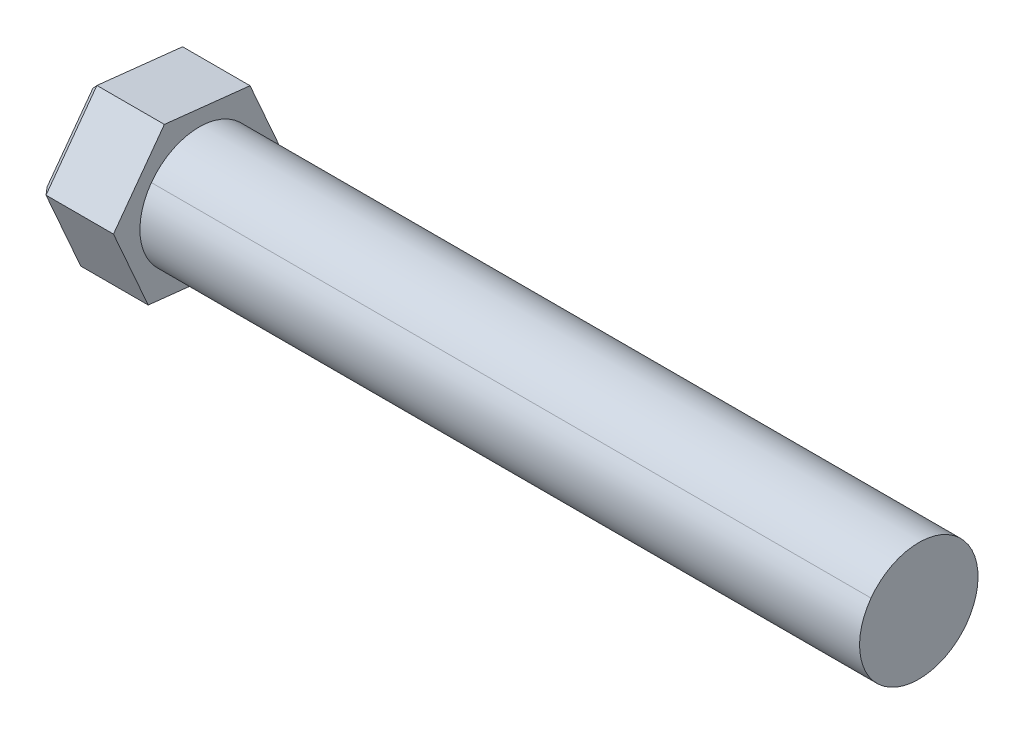
ISO-10303-21;
HEADER;
FILE_DESCRIPTION(('STEP AP214'),'2;1');
FILE_NAME('part.step','',(''),(''),'','','');
FILE_SCHEMA(('AUTOMOTIVE_DESIGN { 1 0 10303 214 1 1 1 1 }'));
ENDSEC;
DATA;
#1=APPLICATION_CONTEXT('core data for automotive mechanical design processes');
#2=APPLICATION_PROTOCOL_DEFINITION('international standard','automotive_design',2000,#1);
#3=PRODUCT_CONTEXT('',#1,'mechanical');
#4=PRODUCT('Part','Part','',(#3));
#5=PRODUCT_RELATED_PRODUCT_CATEGORY('part','',(#4));
#6=PRODUCT_DEFINITION_FORMATION('','',#4);
#7=PRODUCT_DEFINITION_CONTEXT('part definition',#1,'design');
#8=PRODUCT_DEFINITION('design','',#6,#7);
#9=PRODUCT_DEFINITION_SHAPE('','',#8);
#10=(LENGTH_UNIT() NAMED_UNIT(*) SI_UNIT(.MILLI.,.METRE.));
#11=(NAMED_UNIT(*) PLANE_ANGLE_UNIT() SI_UNIT($,.RADIAN.));
#12=(NAMED_UNIT(*) SI_UNIT($,.STERADIAN.) SOLID_ANGLE_UNIT());
#13=UNCERTAINTY_MEASURE_WITH_UNIT(LENGTH_MEASURE(1.E-05),#10,'distance_accuracy_value','');
#14=(GEOMETRIC_REPRESENTATION_CONTEXT(3) GLOBAL_UNCERTAINTY_ASSIGNED_CONTEXT((#13)) GLOBAL_UNIT_ASSIGNED_CONTEXT((#10,
#11,#12)) REPRESENTATION_CONTEXT('',''));
#15=CARTESIAN_POINT('',(0.,0.,0.));
#16=DIRECTION('',(0.,0.,1.));
#17=DIRECTION('',(1.,0.,0.));
#18=AXIS2_PLACEMENT_3D('',#15,#16,#17);
#19=CARTESIAN_POINT('',(-26.156988266467,-0.505944143547208,35.0040039047274));
#20=DIRECTION('',(0.707106781186545,-0.28525456636669,0.647016099001374));
#21=DIRECTION('',(0.,-0.915018942281472,-0.403410876484628));
#22=AXIS2_PLACEMENT_3D('',#19,#20,#21);
#23=PLANE('',#22);
#24=DIRECTION('',(0.65465367070798,0.60993906340706,-0.446545529995191));
#25=VECTOR('',#24,1.);
#26=CARTESIAN_POINT('',(-26.7966473512185,1.26354972035595,36.4831996817549));
#27=LINE('',#26,#25);
#28=CARTESIAN_POINT('',(-26.156988266467,1.85951836837592,36.046882102251));
#29=VERTEX_POINT('',#28);
#30=CARTESIAN_POINT('',(-25.656988266467,2.32536702293815,35.7058273201765));
#31=VERTEX_POINT('',#30);
#32=EDGE_CURVE('E25',#29,#31,#27,.T.);
#33=ORIENTED_EDGE('',*,*,#32,.T.);
#34=DIRECTION('',(0.,0.915018942281472,0.403410876484628));
#35=VECTOR('',#34,1.);
#36=CARTESIAN_POINT('',(-25.656988266467,2.32536702293815,35.7058273201765));
#37=LINE('',#36,#35);
#38=CARTESIAN_POINT('',(-25.656988266467,-2.93384443354793,33.3871615469969));
#39=VERTEX_POINT('',#38);
#40=EDGE_CURVE('E219',#39,#31,#37,.T.);
#41=ORIENTED_EDGE('',*,*,#40,.F.);
#42=DIRECTION('',(-0.65465367070798,0.0817502412186923,0.751495488668597));
#43=VECTOR('',#42,1.);
#44=CARTESIAN_POINT('',(-26.7966473512185,-2.79152887151228,34.6954084860002));
#45=LINE('',#44,#43);
#46=CARTESIAN_POINT('',(-26.156988266467,-2.87140665547034,33.9611257072038));
#47=VERTEX_POINT('',#46);
#48=EDGE_CURVE('E11',#39,#47,#45,.T.);
#49=ORIENTED_EDGE('',*,*,#48,.T.);
#50=DIRECTION('',(0.,-0.915018942281472,-0.403410876484628));
#51=VECTOR('',#50,1.);
#52=CARTESIAN_POINT('',(-26.156988266467,-0.505944143547208,35.0040039047274));
#53=LINE('',#52,#51);
#54=EDGE_CURVE('E230',#29,#47,#53,.T.);
#55=ORIENTED_EDGE('',*,*,#54,.F.);
#56=EDGE_LOOP('',(#33,#41,#49,#55));
#57=FACE_BOUND('',#56,.T.);
#58=ADVANCED_FACE('F17',(#57),#23,.F.);
#59=CARTESIAN_POINT('',(-26.156988266467,-4.95729692354026,35.4882372354672));
#60=DIRECTION('',(0.707106781186545,0.417705095209352,0.570545750519755));
#61=DIRECTION('',(0.,-0.806873538339371,0.590724210717408));
#62=AXIS2_PLACEMENT_3D('',#59,#60,#61);
#63=PLANE('',#62);
#64=DIRECTION('',(-0.65465367070798,0.691689304625752,0.304949958673404));
#65=VECTOR('',#64,1.);
#66=CARTESIAN_POINT('',(-26.7966473512185,-6.36734075963214,37.3133139630231));
#67=LINE('',#66,#65);
#68=CARTESIAN_POINT('',(-25.656988266467,-7.57147362424998,36.7824393855982));
#69=VERTEX_POINT('',#68);
#70=CARTESIAN_POINT('',(-26.156988266467,-7.04318719161017,37.0153487637306));
#71=VERTEX_POINT('',#70);
#72=EDGE_CURVE('E257',#69,#71,#67,.T.);
#73=ORIENTED_EDGE('',*,*,#72,.T.);
#74=DIRECTION('',(0.,-0.806873538339371,0.590724210717407));
#75=VECTOR('',#74,1.);
#76=CARTESIAN_POINT('',(-26.156988266467,-4.95729692354026,35.4882372354672));
#77=LINE('',#76,#75);
#78=EDGE_CURVE('E234',#47,#71,#77,.T.);
#79=ORIENTED_EDGE('',*,*,#78,.F.);
#80=ORIENTED_EDGE('',*,*,#48,.F.);
#81=DIRECTION('',(0.,0.806873538339371,-0.590724210717407));
#82=VECTOR('',#81,1.);
#83=CARTESIAN_POINT('',(-25.656988266467,-2.93384443354793,33.3871615469969));
#84=LINE('',#83,#82);
#85=EDGE_CURVE('E208',#69,#39,#84,.T.);
#86=ORIENTED_EDGE('',*,*,#85,.F.);
#87=EDGE_LOOP('',(#73,#79,#80,#86));
#88=FACE_BOUND('',#87,.T.);
#89=ADVANCED_FACE('F287',(#88),#63,.F.);
#90=CARTESIAN_POINT('',(-26.156988266467,2.13909061222913,38.616871828038));
#91=DIRECTION('',(0.707106781186545,-0.702959661576042,0.0764703484816184));
#92=DIRECTION('',(0.,-0.108145403942101,-0.994135087202036));
#93=AXIS2_PLACEMENT_3D('',#90,#91,#92);
#94=PLANE('',#93);
#95=DIRECTION('',(0.65465367070798,0.691689304625752,0.304949958673405));
#96=VECTOR('',#95,1.);
#97=CARTESIAN_POINT('',(-26.7966473512185,1.74281642410431,40.8888963545325));
#98=LINE('',#97,#96);
#99=CARTESIAN_POINT('',(-26.156988266467,2.41866285608235,41.186861553825));
#100=VERTEX_POINT('',#99);
#101=CARTESIAN_POINT('',(-25.656988266467,2.94694928872216,41.4197709319574));
#102=VERTEX_POINT('',#101);
#103=EDGE_CURVE('E254',#100,#102,#98,.T.);
#104=ORIENTED_EDGE('',*,*,#103,.T.);
#105=DIRECTION('',(0.,0.108145403942101,0.994135087202036));
#106=VECTOR('',#105,1.);
#107=CARTESIAN_POINT('',(-25.656988266467,2.94694928872216,41.4197709319574));
#108=LINE('',#107,#106);
#109=EDGE_CURVE('E158',#31,#102,#108,.T.);
#110=ORIENTED_EDGE('',*,*,#109,.F.);
#111=ORIENTED_EDGE('',*,*,#32,.F.);
#112=DIRECTION('',(0.,-0.108145403942101,-0.994135087202036));
#113=VECTOR('',#112,1.);
#114=CARTESIAN_POINT('',(-26.156988266467,2.13909061222913,38.616871828038));
#115=LINE('',#114,#113);
#116=EDGE_CURVE('E226',#100,#29,#115,.T.);
#117=ORIENTED_EDGE('',*,*,#116,.F.);
#118=EDGE_LOOP('',(#104,#110,#111,#117));
#119=FACE_BOUND('',#118,.T.);
#120=ADVANCED_FACE('F271',(#119),#94,.F.);
#121=CARTESIAN_POINT('',(-26.156988266467,-6.76361494775696,39.5853384895176));
#122=DIRECTION('',(0.707106781186545,0.702959661576042,-0.0764703484816184));
#123=DIRECTION('',(0.,-0.108145403942101,-0.994135087202036));
#124=AXIS2_PLACEMENT_3D('',#121,#122,#123);
#125=PLANE('',#124);
#126=DIRECTION('',(-0.65465367070798,0.60993906340706,-0.446545529995192));
#127=VECTOR('',#126,1.);
#128=CARTESIAN_POINT('',(-26.7966473512185,-5.88807405588377,41.7190106358007));
#129=LINE('',#128,#127);
#130=CARTESIAN_POINT('',(-25.656988266467,-6.94989135846597,42.4963829973791));
#131=VERTEX_POINT('',#130);
#132=CARTESIAN_POINT('',(-26.156988266467,-6.48404270390375,42.1553282153046));
#133=VERTEX_POINT('',#132);
#134=EDGE_CURVE('E46',#131,#133,#129,.T.);
#135=ORIENTED_EDGE('',*,*,#134,.T.);
#136=DIRECTION('',(0.,0.108145403942101,0.994135087202036));
#137=VECTOR('',#136,1.);
#138=CARTESIAN_POINT('',(-26.156988266467,-6.76361494775696,39.5853384895176));
#139=LINE('',#138,#137);
#140=EDGE_CURVE('E238',#71,#133,#139,.T.);
#141=ORIENTED_EDGE('',*,*,#140,.F.);
#142=ORIENTED_EDGE('',*,*,#72,.F.);
#143=DIRECTION('',(0.,-0.108145403942101,-0.994135087202036));
#144=VECTOR('',#143,1.);
#145=CARTESIAN_POINT('',(-25.656988266467,-7.57147362424998,36.7824393855982));
#146=LINE('',#145,#144);
#147=EDGE_CURVE('E197',#131,#69,#146,.T.);
#148=ORIENTED_EDGE('',*,*,#147,.F.);
#149=EDGE_LOOP('',(#135,#141,#142,#148));
#150=FACE_BOUND('',#149,.T.);
#151=ADVANCED_FACE('F300',(#150),#125,.F.);
#152=CARTESIAN_POINT('',(-26.156988266467,0.33277258801243,42.7139730820884));
#153=DIRECTION('',(0.707106781186545,-0.417705095209352,-0.570545750519755));
#154=DIRECTION('',(0.,-0.806873538339371,0.590724210717407));
#155=AXIS2_PLACEMENT_3D('',#152,#153,#154);
#156=PLANE('',#155);
#157=DIRECTION('',(0.65465367070798,0.0817502412186919,0.751495488668597));
#158=VECTOR('',#157,1.);
#159=CARTESIAN_POINT('',(-26.7966473512185,-1.83299546401555,43.5068018315555));
#160=LINE('',#159,#158);
#161=CARTESIAN_POINT('',(-26.156988266467,-1.75311768005749,44.2410846103517));
#162=VERTEX_POINT('',#161);
#163=CARTESIAN_POINT('',(-25.656988266467,-1.69067990197989,44.8150487705587));
#164=VERTEX_POINT('',#163);
#165=EDGE_CURVE('E36',#162,#164,#160,.T.);
#166=ORIENTED_EDGE('',*,*,#165,.T.);
#167=DIRECTION('',(0.,-0.806873538339371,0.590724210717407));
#168=VECTOR('',#167,1.);
#169=CARTESIAN_POINT('',(-25.656988266467,-1.69067990197989,44.8150487705587));
#170=LINE('',#169,#168);
#171=EDGE_CURVE('E165',#102,#164,#170,.T.);
#172=ORIENTED_EDGE('',*,*,#171,.F.);
#173=ORIENTED_EDGE('',*,*,#103,.F.);
#174=DIRECTION('',(0.,0.806873538339371,-0.590724210717407));
#175=VECTOR('',#174,1.);
#176=CARTESIAN_POINT('',(-26.156988266467,0.33277258801243,42.7139730820884));
#177=LINE('',#176,#175);
#178=EDGE_CURVE('E246',#162,#100,#177,.T.);
#179=ORIENTED_EDGE('',*,*,#178,.F.);
#180=EDGE_LOOP('',(#166,#172,#173,#179));
#181=FACE_BOUND('',#180,.T.);
#182=ADVANCED_FACE('F292',(#181),#156,.F.);
#183=CARTESIAN_POINT('',(-26.156988266467,-4.11858019198062,43.1982064128281));
#184=DIRECTION('',(0.707106781186545,0.28525456636669,-0.647016099001373));
#185=DIRECTION('',(0.,-0.915018942281472,-0.403410876484628));
#186=AXIS2_PLACEMENT_3D('',#183,#184,#185);
#187=PLANE('',#186);
#188=ORIENTED_EDGE('',*,*,#134,.F.);
#189=DIRECTION('',(0.,-0.915018942281472,-0.403410876484628));
#190=VECTOR('',#189,1.);
#191=CARTESIAN_POINT('',(-25.656988266467,-6.94989135846597,42.4963829973791));
#192=LINE('',#191,#190);
#193=EDGE_CURVE('E186',#164,#131,#192,.T.);
#194=ORIENTED_EDGE('',*,*,#193,.F.);
#195=ORIENTED_EDGE('',*,*,#165,.F.);
#196=DIRECTION('',(0.,0.915018942281472,0.403410876484628));
#197=VECTOR('',#196,1.);
#198=CARTESIAN_POINT('',(-26.156988266467,-4.11858019198062,43.1982064128281));
#199=LINE('',#198,#197);
#200=EDGE_CURVE('E242',#133,#162,#199,.T.);
#201=ORIENTED_EDGE('',*,*,#200,.F.);
#202=EDGE_LOOP('',(#188,#194,#195,#201));
#203=FACE_BOUND('',#202,.T.);
#204=ADVANCED_FACE('F308',(#203),#187,.F.);
#205=CARTESIAN_POINT('',(-26.156988266467,-2.31226216776391,39.1011051587778));
#206=DIRECTION('',(-1.,0.,0.));
#207=DIRECTION('',(0.,1.,0.));
#208=AXIS2_PLACEMENT_3D('',#205,#206,#207);
#209=PLANE('',#208);
#210=ORIENTED_EDGE('',*,*,#116,.T.);
#211=ORIENTED_EDGE('',*,*,#54,.T.);
#212=ORIENTED_EDGE('',*,*,#78,.T.);
#213=ORIENTED_EDGE('',*,*,#140,.T.);
#214=ORIENTED_EDGE('',*,*,#200,.T.);
#215=ORIENTED_EDGE('',*,*,#178,.T.);
#216=EDGE_LOOP('',(#210,#211,#212,#213,#214,#215));
#217=FACE_BOUND('',#216,.T.);
#218=ADVANCED_FACE('F290',(#217),#209,.T.);
#219=CARTESIAN_POINT('',(-21.156988266467,-2.31226216776391,39.1011051587778));
#220=DIRECTION('',(-1.,0.,0.));
#221=DIRECTION('',(0.,1.,0.));
#222=AXIS2_PLACEMENT_3D('',#219,#220,#221);
#223=PLANE('',#222);
#224=CARTESIAN_POINT('',(-21.156988266467,-2.31226216776391,39.1011051587778));
#225=DIRECTION('',(-1.,0.,0.));
#226=DIRECTION('',(0.,0.590724210717407,0.806873538339371));
#227=AXIS2_PLACEMENT_3D('',#224,#225,#226);
#228=CIRCLE('',#227,3.95);
#229=CARTESIAN_POINT('',(-21.156988266467,-4.64562280009767,35.9139546823373));
#230=VERTEX_POINT('',#229);
#231=CARTESIAN_POINT('',(-21.156988266467,0.0210984645698524,42.2882556352183));
#232=VERTEX_POINT('',#231);
#233=EDGE_CURVE('E126',#230,#232,#228,.T.);
#234=ORIENTED_EDGE('',*,*,#233,.T.);
#235=CARTESIAN_POINT('',(-21.156988266467,-2.31226216776391,39.1011051587778));
#236=DIRECTION('',(-1.,0.,0.));
#237=DIRECTION('',(0.,0.590724210717407,0.806873538339371));
#238=AXIS2_PLACEMENT_3D('',#235,#236,#237);
#239=CIRCLE('',#238,3.95);
#240=EDGE_CURVE('E131',#232,#230,#239,.T.);
#241=ORIENTED_EDGE('',*,*,#240,.T.);
#242=EDGE_LOOP('',(#234,#241));
#243=FACE_BOUND('',#242,.T.);
#244=DIRECTION('',(0.,-0.108145403942101,-0.994135087202036));
#245=VECTOR('',#244,1.);
#246=CARTESIAN_POINT('',(-21.156988266467,2.94694928872216,41.4197709319574));
#247=LINE('',#246,#245);
#248=CARTESIAN_POINT('',(-21.156988266467,2.94694928872216,41.4197709319574));
#249=VERTEX_POINT('',#248);
#250=CARTESIAN_POINT('',(-21.156988266467,2.32536702293815,35.7058273201765));
#251=VERTEX_POINT('',#250);
#252=EDGE_CURVE('E157',#249,#251,#247,.T.);
#253=ORIENTED_EDGE('',*,*,#252,.F.);
#254=DIRECTION('',(0.,0.806873538339371,-0.590724210717407));
#255=VECTOR('',#254,1.);
#256=CARTESIAN_POINT('',(-21.156988266467,-1.69067990197989,44.8150487705587));
#257=LINE('',#256,#255);
#258=CARTESIAN_POINT('',(-21.156988266467,-1.69067990197989,44.8150487705587));
#259=VERTEX_POINT('',#258);
#260=EDGE_CURVE('E173',#259,#249,#257,.T.);
#261=ORIENTED_EDGE('',*,*,#260,.F.);
#262=DIRECTION('',(0.,0.915018942281472,0.403410876484628));
#263=VECTOR('',#262,1.);
#264=CARTESIAN_POINT('',(-21.156988266467,-6.94989135846597,42.4963829973791));
#265=LINE('',#264,#263);
#266=CARTESIAN_POINT('',(-21.156988266467,-6.94989135846597,42.4963829973791));
#267=VERTEX_POINT('',#266);
#268=EDGE_CURVE('E194',#267,#259,#265,.T.);
#269=ORIENTED_EDGE('',*,*,#268,.F.);
#270=DIRECTION('',(0.,0.108145403942101,0.994135087202036));
#271=VECTOR('',#270,1.);
#272=CARTESIAN_POINT('',(-21.156988266467,-7.57147362424998,36.7824393855982));
#273=LINE('',#272,#271);
#274=CARTESIAN_POINT('',(-21.156988266467,-7.57147362424998,36.7824393855982));
#275=VERTEX_POINT('',#274);
#276=EDGE_CURVE('E205',#275,#267,#273,.T.);
#277=ORIENTED_EDGE('',*,*,#276,.F.);
#278=DIRECTION('',(0.,-0.806873538339371,0.590724210717407));
#279=VECTOR('',#278,1.);
#280=CARTESIAN_POINT('',(-21.156988266467,-2.93384443354793,33.3871615469969));
#281=LINE('',#280,#279);
#282=CARTESIAN_POINT('',(-21.156988266467,-2.93384443354793,33.3871615469969));
#283=VERTEX_POINT('',#282);
#284=EDGE_CURVE('E216',#283,#275,#281,.T.);
#285=ORIENTED_EDGE('',*,*,#284,.F.);
#286=DIRECTION('',(0.,-0.915018942281472,-0.403410876484628));
#287=VECTOR('',#286,1.);
#288=CARTESIAN_POINT('',(-21.156988266467,2.32536702293815,35.7058273201765));
#289=LINE('',#288,#287);
#290=EDGE_CURVE('E223',#251,#283,#289,.T.);
#291=ORIENTED_EDGE('',*,*,#290,.F.);
#292=EDGE_LOOP('',(#253,#261,#269,#277,#285,#291));
#293=FACE_BOUND('',#292,.T.);
#294=ADVANCED_FACE('F128',(#243,#293),#223,.F.);
#295=CARTESIAN_POINT('',(-21.156988266467,2.32536702293815,35.7058273201765));
#296=DIRECTION('',(0.,0.403410876484628,-0.915018942281472));
#297=DIRECTION('',(-1.,0.,0.));
#298=AXIS2_PLACEMENT_3D('',#295,#296,#297);
#299=PLANE('',#298);
#300=DIRECTION('',(-1.,0.,0.));
#301=VECTOR('',#300,1.);
#302=CARTESIAN_POINT('',(-21.156988266467,-2.93384443354793,33.3871615469969));
#303=LINE('',#302,#301);
#304=EDGE_CURVE('E212',#283,#39,#303,.T.);
#305=ORIENTED_EDGE('',*,*,#304,.T.);
#306=ORIENTED_EDGE('',*,*,#40,.T.);
#307=DIRECTION('',(-1.,0.,0.));
#308=VECTOR('',#307,1.);
#309=CARTESIAN_POINT('',(-21.156988266467,2.32536702293815,35.7058273201765));
#310=LINE('',#309,#308);
#311=EDGE_CURVE('E160',#251,#31,#310,.T.);
#312=ORIENTED_EDGE('',*,*,#311,.F.);
#313=ORIENTED_EDGE('',*,*,#290,.T.);
#314=EDGE_LOOP('',(#305,#306,#312,#313));
#315=FACE_BOUND('',#314,.T.);
#316=ADVANCED_FACE('F269',(#315),#299,.T.);
#317=CARTESIAN_POINT('',(-21.156988266467,-2.93384443354793,33.3871615469969));
#318=DIRECTION('',(0.,-0.590724210717408,-0.806873538339371));
#319=DIRECTION('',(0.,-0.806873538339371,0.590724210717408));
#320=AXIS2_PLACEMENT_3D('',#317,#318,#319);
#321=PLANE('',#320);
#322=DIRECTION('',(-1.,0.,0.));
#323=VECTOR('',#322,1.);
#324=CARTESIAN_POINT('',(-21.156988266467,-7.57147362424998,36.7824393855982));
#325=LINE('',#324,#323);
#326=EDGE_CURVE('E201',#275,#69,#325,.T.);
#327=ORIENTED_EDGE('',*,*,#326,.T.);
#328=ORIENTED_EDGE('',*,*,#85,.T.);
#329=ORIENTED_EDGE('',*,*,#304,.F.);
#330=ORIENTED_EDGE('',*,*,#284,.T.);
#331=EDGE_LOOP('',(#327,#328,#329,#330));
#332=FACE_BOUND('',#331,.T.);
#333=ADVANCED_FACE('F284',(#332),#321,.T.);
#334=CARTESIAN_POINT('',(-21.156988266467,-7.57147362424998,36.7824393855982));
#335=DIRECTION('',(0.,-0.994135087202036,0.108145403942101));
#336=DIRECTION('',(-1.,0.,0.));
#337=AXIS2_PLACEMENT_3D('',#334,#335,#336);
#338=PLANE('',#337);
#339=DIRECTION('',(-1.,0.,0.));
#340=VECTOR('',#339,1.);
#341=CARTESIAN_POINT('',(-21.156988266467,-6.94989135846597,42.4963829973791));
#342=LINE('',#341,#340);
#343=EDGE_CURVE('E190',#267,#131,#342,.T.);
#344=ORIENTED_EDGE('',*,*,#343,.T.);
#345=ORIENTED_EDGE('',*,*,#147,.T.);
#346=ORIENTED_EDGE('',*,*,#326,.F.);
#347=ORIENTED_EDGE('',*,*,#276,.T.);
#348=EDGE_LOOP('',(#344,#345,#346,#347));
#349=FACE_BOUND('',#348,.T.);
#350=ADVANCED_FACE('F299',(#349),#338,.T.);
#351=CARTESIAN_POINT('',(-21.156988266467,-6.94989135846597,42.4963829973791));
#352=DIRECTION('',(0.,-0.403410876484628,0.915018942281472));
#353=DIRECTION('',(-1.,0.,0.));
#354=AXIS2_PLACEMENT_3D('',#351,#352,#353);
#355=PLANE('',#354);
#356=DIRECTION('',(-1.,0.,0.));
#357=VECTOR('',#356,1.);
#358=CARTESIAN_POINT('',(-21.156988266467,-1.69067990197989,44.8150487705587));
#359=LINE('',#358,#357);
#360=EDGE_CURVE('E170',#259,#164,#359,.T.);
#361=ORIENTED_EDGE('',*,*,#360,.T.);
#362=ORIENTED_EDGE('',*,*,#193,.T.);
#363=ORIENTED_EDGE('',*,*,#343,.F.);
#364=ORIENTED_EDGE('',*,*,#268,.T.);
#365=EDGE_LOOP('',(#361,#362,#363,#364));
#366=FACE_BOUND('',#365,.T.);
#367=ADVANCED_FACE('F296',(#366),#355,.T.);
#368=CARTESIAN_POINT('',(-21.156988266467,-1.69067990197989,44.8150487705587));
#369=DIRECTION('',(0.,0.590724210717407,0.806873538339371));
#370=DIRECTION('',(1.,0.,0.));
#371=AXIS2_PLACEMENT_3D('',#368,#369,#370);
#372=PLANE('',#371);
#373=DIRECTION('',(-1.,0.,0.));
#374=VECTOR('',#373,1.);
#375=CARTESIAN_POINT('',(-21.156988266467,2.94694928872216,41.4197709319574));
#376=LINE('',#375,#374);
#377=EDGE_CURVE('E154',#249,#102,#376,.T.);
#378=ORIENTED_EDGE('',*,*,#377,.T.);
#379=ORIENTED_EDGE('',*,*,#171,.T.);
#380=ORIENTED_EDGE('',*,*,#360,.F.);
#381=ORIENTED_EDGE('',*,*,#260,.T.);
#382=EDGE_LOOP('',(#378,#379,#380,#381));
#383=FACE_BOUND('',#382,.T.);
#384=ADVANCED_FACE('F294',(#383),#372,.T.);
#385=CARTESIAN_POINT('',(-21.156988266467,2.94694928872216,41.4197709319574));
#386=DIRECTION('',(0.,0.994135087202036,-0.108145403942101));
#387=DIRECTION('',(-1.,0.,0.));
#388=AXIS2_PLACEMENT_3D('',#385,#386,#387);
#389=PLANE('',#388);
#390=ORIENTED_EDGE('',*,*,#311,.T.);
#391=ORIENTED_EDGE('',*,*,#109,.T.);
#392=ORIENTED_EDGE('',*,*,#377,.F.);
#393=ORIENTED_EDGE('',*,*,#252,.T.);
#394=EDGE_LOOP('',(#390,#391,#392,#393));
#395=FACE_BOUND('',#394,.T.);
#396=ADVANCED_FACE('F275',(#395),#389,.T.);
#397=CARTESIAN_POINT('',(26.843011733533,-2.31226216776391,39.1011051587778));
#398=DIRECTION('',(-1.,0.,0.));
#399=DIRECTION('',(0.,1.,0.));
#400=AXIS2_PLACEMENT_3D('',#397,#398,#399);
#401=PLANE('',#400);
#402=CARTESIAN_POINT('',(26.843011733533,-2.31226216776391,39.1011051587778));
#403=DIRECTION('',(-1.,0.,0.));
#404=DIRECTION('',(0.,0.590724210717407,0.806873538339371));
#405=AXIS2_PLACEMENT_3D('',#402,#403,#404);
#406=CIRCLE('',#405,3.95);
#407=CARTESIAN_POINT('',(26.843011733533,-4.64562280009767,35.9139546823373));
#408=VERTEX_POINT('',#407);
#409=CARTESIAN_POINT('',(26.843011733533,0.0210984645698537,42.2882556352183));
#410=VERTEX_POINT('',#409);
#411=EDGE_CURVE('E136',#408,#410,#406,.T.);
#412=ORIENTED_EDGE('',*,*,#411,.F.);
#413=CARTESIAN_POINT('',(26.843011733533,-2.31226216776391,39.1011051587778));
#414=DIRECTION('',(-1.,0.,0.));
#415=DIRECTION('',(0.,0.590724210717407,0.806873538339371));
#416=AXIS2_PLACEMENT_3D('',#413,#414,#415);
#417=CIRCLE('',#416,3.95);
#418=EDGE_CURVE('E146',#410,#408,#417,.T.);
#419=ORIENTED_EDGE('',*,*,#418,.F.);
#420=EDGE_LOOP('',(#412,#419));
#421=FACE_BOUND('',#420,.T.);
#422=ADVANCED_FACE('F375',(#421),#401,.F.);
#423=CARTESIAN_POINT('',(-26.156988266467,-2.31226216776391,39.1011051587778));
#424=DIRECTION('',(1.,0.,0.));
#425=DIRECTION('',(0.,-0.590724210717407,-0.806873538339371));
#426=AXIS2_PLACEMENT_3D('',#423,#424,#425);
#427=CYLINDRICAL_SURFACE('',#426,3.95);
#428=DIRECTION('',(1.,0.,0.));
#429=VECTOR('',#428,1.);
#430=CARTESIAN_POINT('',(-26.156988266467,0.021098464569849,42.2882556352183));
#431=LINE('',#430,#429);
#432=EDGE_CURVE('E140',#232,#410,#431,.T.);
#433=ORIENTED_EDGE('',*,*,#432,.F.);
#434=ORIENTED_EDGE('',*,*,#233,.F.);
#435=DIRECTION('',(1.,0.,0.));
#436=VECTOR('',#435,1.);
#437=CARTESIAN_POINT('',(-26.156988266467,-4.64562280009767,35.9139546823373));
#438=LINE('',#437,#436);
#439=EDGE_CURVE('E137',#230,#408,#438,.T.);
#440=ORIENTED_EDGE('',*,*,#439,.T.);
#441=ORIENTED_EDGE('',*,*,#411,.T.);
#442=EDGE_LOOP('',(#433,#434,#440,#441));
#443=FACE_BOUND('',#442,.T.);
#444=ADVANCED_FACE('F141',(#443),#427,.T.);
#445=CARTESIAN_POINT('',(-26.156988266467,-2.31226216776391,39.1011051587778));
#446=DIRECTION('',(1.,0.,0.));
#447=DIRECTION('',(0.,-0.590724210717407,-0.806873538339371));
#448=AXIS2_PLACEMENT_3D('',#445,#446,#447);
#449=CYLINDRICAL_SURFACE('',#448,3.95);
#450=ORIENTED_EDGE('',*,*,#240,.F.);
#451=ORIENTED_EDGE('',*,*,#432,.T.);
#452=ORIENTED_EDGE('',*,*,#418,.T.);
#453=ORIENTED_EDGE('',*,*,#439,.F.);
#454=EDGE_LOOP('',(#450,#451,#452,#453));
#455=FACE_BOUND('',#454,.T.);
#456=ADVANCED_FACE('F148',(#455),#449,.T.);
#457=CLOSED_SHELL('',(#58,#89,#120,#151,#182,#204,#218,#294,#316,#333,#350,#367,#384,#396,#422,
#444,#456));
#458=MANIFOLD_SOLID_BREP('B1',#457);
#459=ADVANCED_BREP_SHAPE_REPRESENTATION('',(#18,#458),#14);
#460=SHAPE_DEFINITION_REPRESENTATION(#9,#459);
ENDSEC;
END-ISO-10303-21;
